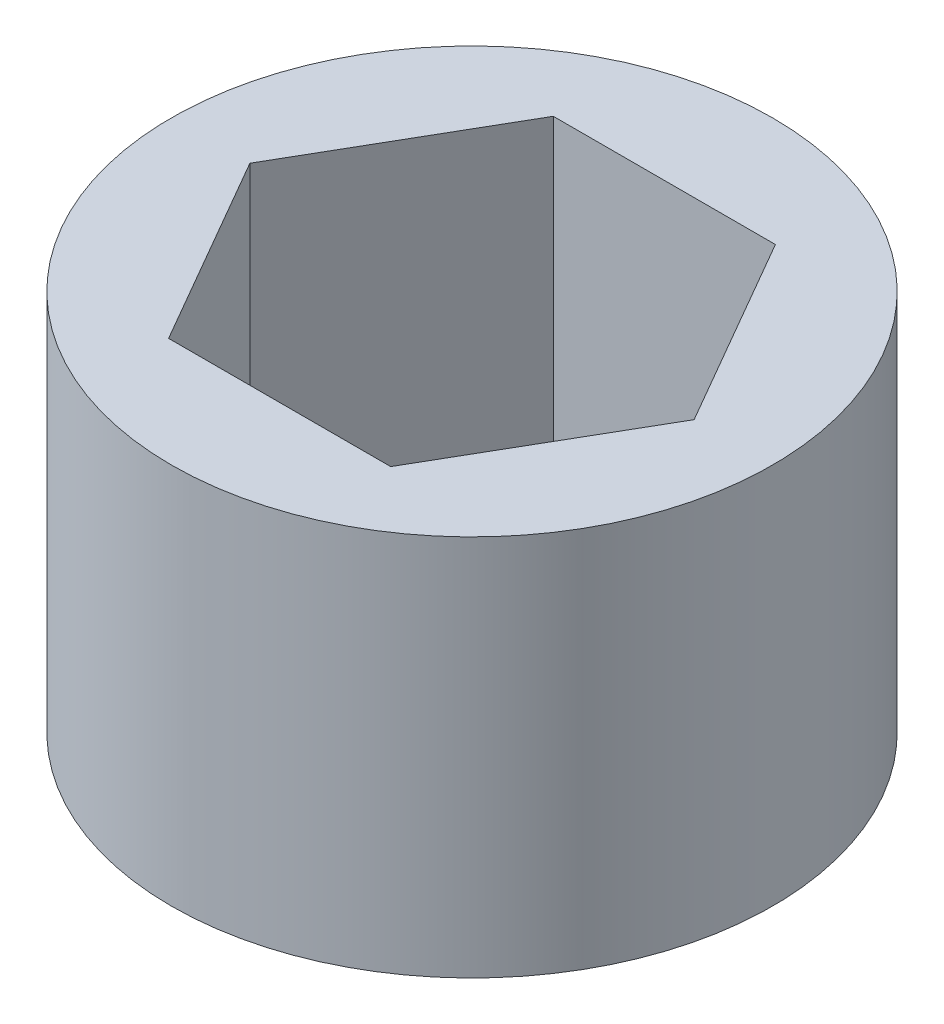
ISO-10303-21;
HEADER;
FILE_DESCRIPTION(('STEP AP214'),'2;1');
FILE_NAME('part.step','',(''),(''),'','','');
FILE_SCHEMA(('AUTOMOTIVE_DESIGN { 1 0 10303 214 1 1 1 1 }'));
ENDSEC;
DATA;
#1=APPLICATION_CONTEXT('core data for automotive mechanical design processes');
#2=APPLICATION_PROTOCOL_DEFINITION('international standard','automotive_design',2000,#1);
#3=PRODUCT_CONTEXT('',#1,'mechanical');
#4=PRODUCT('Part','Part','',(#3));
#5=PRODUCT_RELATED_PRODUCT_CATEGORY('part','',(#4));
#6=PRODUCT_DEFINITION_FORMATION('','',#4);
#7=PRODUCT_DEFINITION_CONTEXT('part definition',#1,'design');
#8=PRODUCT_DEFINITION('design','',#6,#7);
#9=PRODUCT_DEFINITION_SHAPE('','',#8);
#10=(LENGTH_UNIT() NAMED_UNIT(*) SI_UNIT(.MILLI.,.METRE.));
#11=(NAMED_UNIT(*) PLANE_ANGLE_UNIT() SI_UNIT($,.RADIAN.));
#12=(NAMED_UNIT(*) SI_UNIT($,.STERADIAN.) SOLID_ANGLE_UNIT());
#13=UNCERTAINTY_MEASURE_WITH_UNIT(LENGTH_MEASURE(1.E-05),#10,'distance_accuracy_value','');
#14=(GEOMETRIC_REPRESENTATION_CONTEXT(3) GLOBAL_UNCERTAINTY_ASSIGNED_CONTEXT((#13)) GLOBAL_UNIT_ASSIGNED_CONTEXT((#10,
#11,#12)) REPRESENTATION_CONTEXT('',''));
#15=CARTESIAN_POINT('',(0.,0.,0.));
#16=DIRECTION('',(0.,0.,1.));
#17=DIRECTION('',(1.,0.,0.));
#18=AXIS2_PLACEMENT_3D('',#15,#16,#17);
#19=CARTESIAN_POINT('',(0.,12.7,0.));
#20=DIRECTION('',(0.,1.,0.));
#21=DIRECTION('',(0.,0.,1.));
#22=AXIS2_PLACEMENT_3D('',#19,#20,#21);
#23=PLANE('',#22);
#24=CARTESIAN_POINT('',(0.,12.7,0.));
#25=DIRECTION('',(0.,1.,0.));
#26=DIRECTION('',(0.,0.,1.));
#27=AXIS2_PLACEMENT_3D('',#24,#25,#26);
#28=CIRCLE('',#27,9.9949);
#29=CARTESIAN_POINT('',(0.,12.7,9.9949));
#30=VERTEX_POINT('',#29);
#31=EDGE_CURVE('E11',#30,#30,#28,.T.);
#32=ORIENTED_EDGE('',*,*,#31,.T.);
#33=EDGE_LOOP('',(#32));
#34=FACE_BOUND('',#33,.T.);
#35=DIRECTION('',(-0.500000000000001,0.,-0.866025403784438));
#36=VECTOR('',#35,1.);
#37=CARTESIAN_POINT('',(7.38367485763918,12.7,0.));
#38=LINE('',#37,#36);
#39=CARTESIAN_POINT('',(7.38367485763918,12.7,0.));
#40=VERTEX_POINT('',#39);
#41=CARTESIAN_POINT('',(3.69183742881957,12.7,-6.39444999999998));
#42=VERTEX_POINT('',#41);
#43=EDGE_CURVE('E94',#40,#42,#38,.T.);
#44=ORIENTED_EDGE('',*,*,#43,.F.);
#45=DIRECTION('',(0.499999999999995,0.,-0.866025403784441));
#46=VECTOR('',#45,1.);
#47=CARTESIAN_POINT('',(3.69183742881966,12.7,6.39444999999993));
#48=LINE('',#47,#46);
#49=CARTESIAN_POINT('',(3.69183742881966,12.7,6.39444999999993));
#50=VERTEX_POINT('',#49);
#51=EDGE_CURVE('E86',#50,#40,#48,.T.);
#52=ORIENTED_EDGE('',*,*,#51,.F.);
#53=DIRECTION('',(1.,0.,0.));
#54=VECTOR('',#53,1.);
#55=CARTESIAN_POINT('',(-3.69183742881953,12.7,6.39445000000001));
#56=LINE('',#55,#54);
#57=CARTESIAN_POINT('',(-3.69183742881953,12.7,6.39445000000001));
#58=VERTEX_POINT('',#57);
#59=EDGE_CURVE('E114',#58,#50,#56,.T.);
#60=ORIENTED_EDGE('',*,*,#59,.F.);
#61=DIRECTION('',(0.500000000000007,0.,0.866025403784434));
#62=VECTOR('',#61,1.);
#63=CARTESIAN_POINT('',(-7.38367485763918,12.7,0.));
#64=LINE('',#63,#62);
#65=CARTESIAN_POINT('',(-7.38367485763918,12.7,0.));
#66=VERTEX_POINT('',#65);
#67=EDGE_CURVE('E112',#66,#58,#64,.T.);
#68=ORIENTED_EDGE('',*,*,#67,.F.);
#69=DIRECTION('',(-0.499999999999995,0.,0.866025403784442));
#70=VECTOR('',#69,1.);
#71=CARTESIAN_POINT('',(-3.69183742881962,12.7,-6.39444999999996));
#72=LINE('',#71,#70);
#73=CARTESIAN_POINT('',(-3.69183742881962,12.7,-6.39444999999996));
#74=VERTEX_POINT('',#73);
#75=EDGE_CURVE('E108',#74,#66,#72,.T.);
#76=ORIENTED_EDGE('',*,*,#75,.F.);
#77=DIRECTION('',(-1.,0.,0.));
#78=VECTOR('',#77,1.);
#79=CARTESIAN_POINT('',(3.69183742881957,12.7,-6.39444999999998));
#80=LINE('',#79,#78);
#81=EDGE_CURVE('E106',#42,#74,#80,.T.);
#82=ORIENTED_EDGE('',*,*,#81,.F.);
#83=EDGE_LOOP('',(#44,#52,#60,#68,#76,#82));
#84=FACE_BOUND('',#83,.T.);
#85=ADVANCED_FACE('F33',(#34,#84),#23,.T.);
#86=CARTESIAN_POINT('',(0.,0.,0.));
#87=DIRECTION('',(0.,1.,0.));
#88=DIRECTION('',(0.,0.,1.));
#89=AXIS2_PLACEMENT_3D('',#86,#87,#88);
#90=PLANE('',#89);
#91=CARTESIAN_POINT('',(0.,0.,0.));
#92=DIRECTION('',(0.,1.,0.));
#93=DIRECTION('',(0.,0.,1.));
#94=AXIS2_PLACEMENT_3D('',#91,#92,#93);
#95=CIRCLE('',#94,9.9949);
#96=CARTESIAN_POINT('',(0.,0.,9.9949));
#97=VERTEX_POINT('',#96);
#98=EDGE_CURVE('E37',#97,#97,#95,.T.);
#99=ORIENTED_EDGE('',*,*,#98,.F.);
#100=EDGE_LOOP('',(#99));
#101=FACE_BOUND('',#100,.T.);
#102=DIRECTION('',(0.499999999999995,0.,-0.866025403784441));
#103=VECTOR('',#102,1.);
#104=CARTESIAN_POINT('',(3.69183742881966,0.,6.39444999999993));
#105=LINE('',#104,#103);
#106=CARTESIAN_POINT('',(3.69183742881966,0.,6.39444999999993));
#107=VERTEX_POINT('',#106);
#108=CARTESIAN_POINT('',(7.38367485763918,0.,0.));
#109=VERTEX_POINT('',#108);
#110=EDGE_CURVE('E56',#107,#109,#105,.T.);
#111=ORIENTED_EDGE('',*,*,#110,.T.);
#112=DIRECTION('',(-0.500000000000001,0.,-0.866025403784438));
#113=VECTOR('',#112,1.);
#114=CARTESIAN_POINT('',(7.38367485763918,0.,0.));
#115=LINE('',#114,#113);
#116=CARTESIAN_POINT('',(3.69183742881957,0.,-6.39444999999998));
#117=VERTEX_POINT('',#116);
#118=EDGE_CURVE('E101',#109,#117,#115,.T.);
#119=ORIENTED_EDGE('',*,*,#118,.T.);
#120=DIRECTION('',(-1.,0.,0.));
#121=VECTOR('',#120,1.);
#122=CARTESIAN_POINT('',(3.69183742881957,0.,-6.39444999999998));
#123=LINE('',#122,#121);
#124=CARTESIAN_POINT('',(-3.69183742881962,0.,-6.39444999999996));
#125=VERTEX_POINT('',#124);
#126=EDGE_CURVE('E118',#117,#125,#123,.T.);
#127=ORIENTED_EDGE('',*,*,#126,.T.);
#128=DIRECTION('',(-0.499999999999995,0.,0.866025403784442));
#129=VECTOR('',#128,1.);
#130=CARTESIAN_POINT('',(-3.69183742881962,0.,-6.39444999999996));
#131=LINE('',#130,#129);
#132=CARTESIAN_POINT('',(-7.38367485763918,0.,0.));
#133=VERTEX_POINT('',#132);
#134=EDGE_CURVE('E121',#125,#133,#131,.T.);
#135=ORIENTED_EDGE('',*,*,#134,.T.);
#136=DIRECTION('',(0.500000000000007,0.,0.866025403784434));
#137=VECTOR('',#136,1.);
#138=CARTESIAN_POINT('',(-7.38367485763918,0.,0.));
#139=LINE('',#138,#137);
#140=CARTESIAN_POINT('',(-3.69183742881953,0.,6.39445000000001));
#141=VERTEX_POINT('',#140);
#142=EDGE_CURVE('E124',#133,#141,#139,.T.);
#143=ORIENTED_EDGE('',*,*,#142,.T.);
#144=DIRECTION('',(1.,0.,0.));
#145=VECTOR('',#144,1.);
#146=CARTESIAN_POINT('',(-3.69183742881953,0.,6.39445000000001));
#147=LINE('',#146,#145);
#148=EDGE_CURVE('E95',#141,#107,#147,.T.);
#149=ORIENTED_EDGE('',*,*,#148,.T.);
#150=EDGE_LOOP('',(#111,#119,#127,#135,#143,#149));
#151=FACE_BOUND('',#150,.T.);
#152=ADVANCED_FACE('F141',(#101,#151),#90,.F.);
#153=CARTESIAN_POINT('',(0.,12.7,0.));
#154=DIRECTION('',(0.,-1.,0.));
#155=DIRECTION('',(0.,0.,-1.));
#156=AXIS2_PLACEMENT_3D('',#153,#154,#155);
#157=CYLINDRICAL_SURFACE('',#156,9.9949);
#158=ORIENTED_EDGE('',*,*,#31,.F.);
#159=EDGE_LOOP('',(#158));
#160=FACE_BOUND('',#159,.T.);
#161=ORIENTED_EDGE('',*,*,#98,.T.);
#162=EDGE_LOOP('',(#161));
#163=FACE_BOUND('',#162,.T.);
#164=ADVANCED_FACE('F35',(#160,#163),#157,.T.);
#165=CARTESIAN_POINT('',(3.69183742881966,12.7,6.39444999999993));
#166=DIRECTION('',(-0.866025403784441,0.,-0.499999999999995));
#167=DIRECTION('',(-0.499999999999995,0.,0.866025403784441));
#168=AXIS2_PLACEMENT_3D('',#165,#166,#167);
#169=PLANE('',#168);
#170=ORIENTED_EDGE('',*,*,#110,.F.);
#171=DIRECTION('',(0.,-1.,0.));
#172=VECTOR('',#171,1.);
#173=CARTESIAN_POINT('',(3.69183742881966,12.7,6.39444999999993));
#174=LINE('',#173,#172);
#175=EDGE_CURVE('E90',#50,#107,#174,.T.);
#176=ORIENTED_EDGE('',*,*,#175,.F.);
#177=ORIENTED_EDGE('',*,*,#51,.T.);
#178=DIRECTION('',(0.,-1.,0.));
#179=VECTOR('',#178,1.);
#180=CARTESIAN_POINT('',(7.38367485763918,12.7,0.));
#181=LINE('',#180,#179);
#182=EDGE_CURVE('E89',#40,#109,#181,.T.);
#183=ORIENTED_EDGE('',*,*,#182,.T.);
#184=EDGE_LOOP('',(#170,#176,#177,#183));
#185=FACE_BOUND('',#184,.T.);
#186=ADVANCED_FACE('F88',(#185),#169,.T.);
#187=CARTESIAN_POINT('',(7.38367485763918,12.7,0.));
#188=DIRECTION('',(-0.866025403784438,0.,0.500000000000001));
#189=DIRECTION('',(0.500000000000001,0.,0.866025403784438));
#190=AXIS2_PLACEMENT_3D('',#187,#188,#189);
#191=PLANE('',#190);
#192=ORIENTED_EDGE('',*,*,#118,.F.);
#193=ORIENTED_EDGE('',*,*,#182,.F.);
#194=ORIENTED_EDGE('',*,*,#43,.T.);
#195=DIRECTION('',(0.,-1.,0.));
#196=VECTOR('',#195,1.);
#197=CARTESIAN_POINT('',(3.69183742881957,12.7,-6.39444999999998));
#198=LINE('',#197,#196);
#199=EDGE_CURVE('E102',#42,#117,#198,.T.);
#200=ORIENTED_EDGE('',*,*,#199,.T.);
#201=EDGE_LOOP('',(#192,#193,#194,#200));
#202=FACE_BOUND('',#201,.T.);
#203=ADVANCED_FACE('F98',(#202),#191,.T.);
#204=CARTESIAN_POINT('',(3.69183742881957,12.7,-6.39444999999998));
#205=DIRECTION('',(0.,0.,1.));
#206=DIRECTION('',(1.,0.,0.));
#207=AXIS2_PLACEMENT_3D('',#204,#205,#206);
#208=PLANE('',#207);
#209=ORIENTED_EDGE('',*,*,#126,.F.);
#210=ORIENTED_EDGE('',*,*,#199,.F.);
#211=ORIENTED_EDGE('',*,*,#81,.T.);
#212=DIRECTION('',(0.,-1.,0.));
#213=VECTOR('',#212,1.);
#214=CARTESIAN_POINT('',(-3.69183742881962,12.7,-6.39444999999996));
#215=LINE('',#214,#213);
#216=EDGE_CURVE('E133',#74,#125,#215,.T.);
#217=ORIENTED_EDGE('',*,*,#216,.T.);
#218=EDGE_LOOP('',(#209,#210,#211,#217));
#219=FACE_BOUND('',#218,.T.);
#220=ADVANCED_FACE('F137',(#219),#208,.T.);
#221=CARTESIAN_POINT('',(-3.69183742881962,12.7,-6.39444999999996));
#222=DIRECTION('',(0.866025403784442,0.,0.499999999999995));
#223=DIRECTION('',(0.499999999999995,0.,-0.866025403784442));
#224=AXIS2_PLACEMENT_3D('',#221,#222,#223);
#225=PLANE('',#224);
#226=ORIENTED_EDGE('',*,*,#134,.F.);
#227=ORIENTED_EDGE('',*,*,#216,.F.);
#228=ORIENTED_EDGE('',*,*,#75,.T.);
#229=DIRECTION('',(0.,-1.,0.));
#230=VECTOR('',#229,1.);
#231=CARTESIAN_POINT('',(-7.38367485763918,12.7,0.));
#232=LINE('',#231,#230);
#233=EDGE_CURVE('E131',#66,#133,#232,.T.);
#234=ORIENTED_EDGE('',*,*,#233,.T.);
#235=EDGE_LOOP('',(#226,#227,#228,#234));
#236=FACE_BOUND('',#235,.T.);
#237=ADVANCED_FACE('F149',(#236),#225,.T.);
#238=CARTESIAN_POINT('',(-7.38367485763918,12.7,0.));
#239=DIRECTION('',(0.866025403784435,0.,-0.500000000000007));
#240=DIRECTION('',(-0.500000000000007,0.,-0.866025403784435));
#241=AXIS2_PLACEMENT_3D('',#238,#239,#240);
#242=PLANE('',#241);
#243=ORIENTED_EDGE('',*,*,#142,.F.);
#244=ORIENTED_EDGE('',*,*,#233,.F.);
#245=ORIENTED_EDGE('',*,*,#67,.T.);
#246=DIRECTION('',(0.,-1.,0.));
#247=VECTOR('',#246,1.);
#248=CARTESIAN_POINT('',(-3.69183742881953,12.7,6.39445000000001));
#249=LINE('',#248,#247);
#250=EDGE_CURVE('E48',#58,#141,#249,.T.);
#251=ORIENTED_EDGE('',*,*,#250,.T.);
#252=EDGE_LOOP('',(#243,#244,#245,#251));
#253=FACE_BOUND('',#252,.T.);
#254=ADVANCED_FACE('F147',(#253),#242,.T.);
#255=CARTESIAN_POINT('',(-3.69183742881953,12.7,6.39445000000001));
#256=DIRECTION('',(0.,0.,-1.));
#257=DIRECTION('',(-1.,0.,0.));
#258=AXIS2_PLACEMENT_3D('',#255,#256,#257);
#259=PLANE('',#258);
#260=ORIENTED_EDGE('',*,*,#148,.F.);
#261=ORIENTED_EDGE('',*,*,#250,.F.);
#262=ORIENTED_EDGE('',*,*,#59,.T.);
#263=ORIENTED_EDGE('',*,*,#175,.T.);
#264=EDGE_LOOP('',(#260,#261,#262,#263));
#265=FACE_BOUND('',#264,.T.);
#266=ADVANCED_FACE('F143',(#265),#259,.T.);
#267=CLOSED_SHELL('',(#85,#152,#164,#186,#203,#220,#237,#254,#266));
#268=MANIFOLD_SOLID_BREP('B2',#267);
#269=ADVANCED_BREP_SHAPE_REPRESENTATION('',(#18,#268),#14);
#270=SHAPE_DEFINITION_REPRESENTATION(#9,#269);
ENDSEC;
END-ISO-10303-21;
